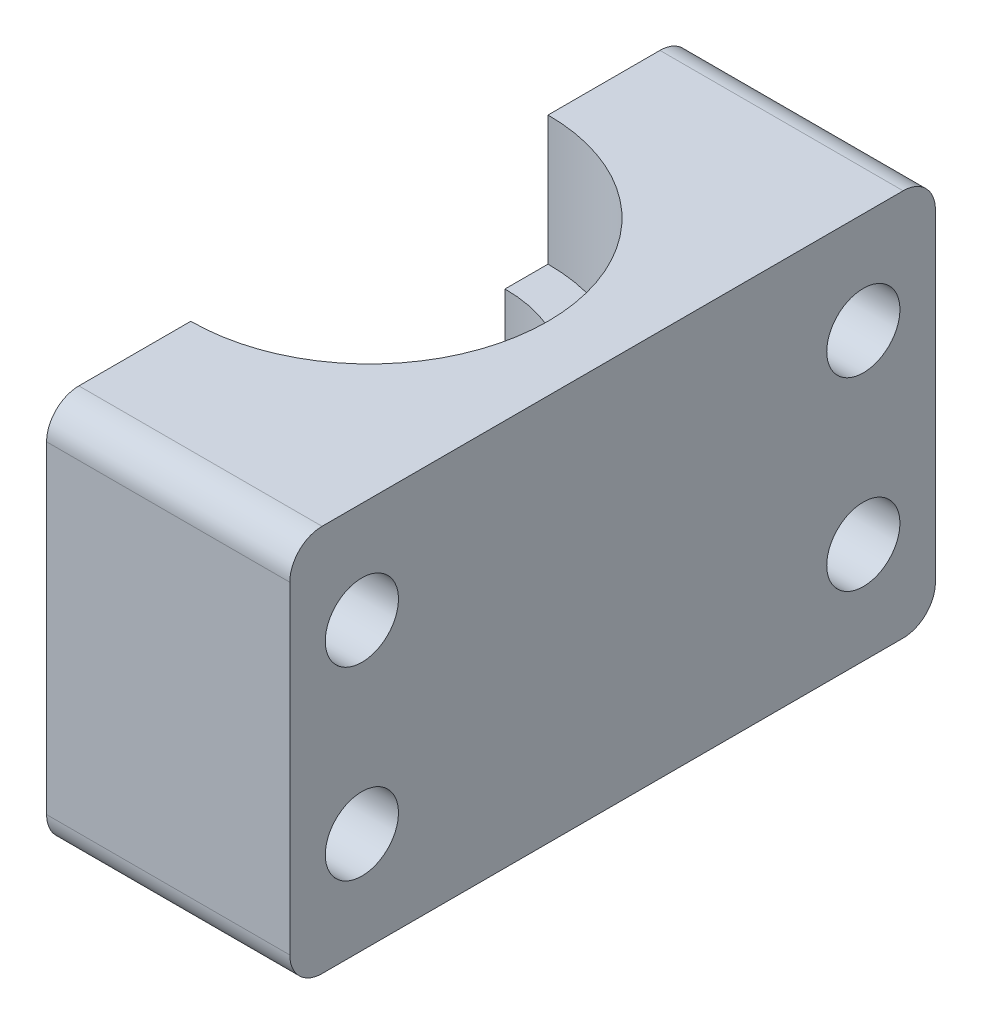
ISO-10303-21;
HEADER;
FILE_DESCRIPTION(('STEP AP214'),'2;1');
FILE_NAME('part.step','',(''),(''),'','','');
FILE_SCHEMA(('AUTOMOTIVE_DESIGN { 1 0 10303 214 1 1 1 1 }'));
ENDSEC;
DATA;
#1=APPLICATION_CONTEXT('core data for automotive mechanical design processes');
#2=APPLICATION_PROTOCOL_DEFINITION('international standard','automotive_design',2000,#1);
#3=PRODUCT_CONTEXT('',#1,'mechanical');
#4=PRODUCT('Part','Part','',(#3));
#5=PRODUCT_RELATED_PRODUCT_CATEGORY('part','',(#4));
#6=PRODUCT_DEFINITION_FORMATION('','',#4);
#7=PRODUCT_DEFINITION_CONTEXT('part definition',#1,'design');
#8=PRODUCT_DEFINITION('design','',#6,#7);
#9=PRODUCT_DEFINITION_SHAPE('','',#8);
#10=(LENGTH_UNIT() NAMED_UNIT(*) SI_UNIT(.MILLI.,.METRE.));
#11=(NAMED_UNIT(*) PLANE_ANGLE_UNIT() SI_UNIT($,.RADIAN.));
#12=(NAMED_UNIT(*) SI_UNIT($,.STERADIAN.) SOLID_ANGLE_UNIT());
#13=UNCERTAINTY_MEASURE_WITH_UNIT(LENGTH_MEASURE(1.E-05),#10,'distance_accuracy_value','');
#14=(GEOMETRIC_REPRESENTATION_CONTEXT(3) GLOBAL_UNCERTAINTY_ASSIGNED_CONTEXT((#13)) GLOBAL_UNIT_ASSIGNED_CONTEXT((#10,
#11,#12)) REPRESENTATION_CONTEXT('',''));
#15=CARTESIAN_POINT('',(0.,0.,0.));
#16=DIRECTION('',(0.,0.,1.));
#17=DIRECTION('',(1.,0.,0.));
#18=AXIS2_PLACEMENT_3D('',#15,#16,#17);
#19=CARTESIAN_POINT('',(100.,50.,-15.));
#20=DIRECTION('',(0.,0.,1.));
#21=DIRECTION('',(0.,-1.,0.));
#22=AXIS2_PLACEMENT_3D('',#19,#20,#21);
#23=PLANE('',#22);
#24=DIRECTION('',(0.,1.,0.));
#25=VECTOR('',#24,1.);
#26=CARTESIAN_POINT('',(0.,50.,-15.));
#27=LINE('',#26,#25);
#28=CARTESIAN_POINT('',(0.,-7.49999999999999,-15.));
#29=VERTEX_POINT('',#28);
#30=CARTESIAN_POINT('',(0.,7.49999999999999,-15.));
#31=VERTEX_POINT('',#30);
#32=EDGE_CURVE('E242',#29,#31,#27,.T.);
#33=ORIENTED_EDGE('',*,*,#32,.T.);
#34=DIRECTION('',(-1.,0.,0.));
#35=VECTOR('',#34,1.);
#36=CARTESIAN_POINT('',(11.3,7.49999999999999,-15.));
#37=LINE('',#36,#35);
#38=CARTESIAN_POINT('',(11.3,7.49999999999999,-15.));
#39=VERTEX_POINT('',#38);
#40=EDGE_CURVE('E186',#31,#39,#37,.F.);
#41=ORIENTED_EDGE('',*,*,#40,.T.);
#42=DIRECTION('',(0.,1.,0.));
#43=VECTOR('',#42,1.);
#44=CARTESIAN_POINT('',(11.3,-9.,-15.));
#45=LINE('',#44,#43);
#46=CARTESIAN_POINT('',(11.3,-7.49999999999999,-15.));
#47=VERTEX_POINT('',#46);
#48=EDGE_CURVE('E224',#47,#39,#45,.T.);
#49=ORIENTED_EDGE('',*,*,#48,.F.);
#50=DIRECTION('',(1.,0.,0.));
#51=VECTOR('',#50,1.);
#52=CARTESIAN_POINT('',(0.,-7.49999999999999,-15.));
#53=LINE('',#52,#51);
#54=EDGE_CURVE('E184',#47,#29,#53,.F.);
#55=ORIENTED_EDGE('',*,*,#54,.T.);
#56=EDGE_LOOP('',(#33,#41,#49,#55));
#57=FACE_BOUND('',#56,.T.);
#58=ADVANCED_FACE('F35',(#57),#23,.F.);
#59=CARTESIAN_POINT('',(100.,50.,15.));
#60=DIRECTION('',(0.,0.,-1.));
#61=DIRECTION('',(0.,1.,0.));
#62=AXIS2_PLACEMENT_3D('',#59,#60,#61);
#63=PLANE('',#62);
#64=DIRECTION('',(0.,-1.,0.));
#65=VECTOR('',#64,1.);
#66=CARTESIAN_POINT('',(0.,50.,15.));
#67=LINE('',#66,#65);
#68=CARTESIAN_POINT('',(0.,7.49999999999999,15.));
#69=VERTEX_POINT('',#68);
#70=CARTESIAN_POINT('',(0.,-7.49999999999999,15.));
#71=VERTEX_POINT('',#70);
#72=EDGE_CURVE('E206',#69,#71,#67,.T.);
#73=ORIENTED_EDGE('',*,*,#72,.T.);
#74=DIRECTION('',(-1.,0.,0.));
#75=VECTOR('',#74,1.);
#76=CARTESIAN_POINT('',(11.3,-7.49999999999999,15.));
#77=LINE('',#76,#75);
#78=CARTESIAN_POINT('',(11.3,-7.49999999999999,15.));
#79=VERTEX_POINT('',#78);
#80=EDGE_CURVE('E11',#71,#79,#77,.F.);
#81=ORIENTED_EDGE('',*,*,#80,.T.);
#82=DIRECTION('',(0.,1.,0.));
#83=VECTOR('',#82,1.);
#84=CARTESIAN_POINT('',(11.3,-9.,15.));
#85=LINE('',#84,#83);
#86=CARTESIAN_POINT('',(11.3,7.49999999999999,15.));
#87=VERTEX_POINT('',#86);
#88=EDGE_CURVE('E156',#79,#87,#85,.T.);
#89=ORIENTED_EDGE('',*,*,#88,.T.);
#90=DIRECTION('',(1.,0.,0.));
#91=VECTOR('',#90,1.);
#92=CARTESIAN_POINT('',(0.,7.49999999999999,15.));
#93=LINE('',#92,#91);
#94=EDGE_CURVE('E43',#87,#69,#93,.F.);
#95=ORIENTED_EDGE('',*,*,#94,.T.);
#96=EDGE_LOOP('',(#73,#81,#89,#95));
#97=FACE_BOUND('',#96,.T.);
#98=ADVANCED_FACE('F222',(#97),#63,.F.);
#99=CARTESIAN_POINT('',(0.,0.,0.));
#100=DIRECTION('',(1.,0.,0.));
#101=DIRECTION('',(0.,0.,-1.));
#102=AXIS2_PLACEMENT_3D('',#99,#100,#101);
#103=PLANE('',#102);
#104=CARTESIAN_POINT('',(0.,4.29999999999999,11.65));
#105=DIRECTION('',(-1.,0.,0.));
#106=DIRECTION('',(0.,0.,1.));
#107=AXIS2_PLACEMENT_3D('',#104,#105,#106);
#108=CIRCLE('',#107,1.7);
#109=CARTESIAN_POINT('',(0.,4.29999999999999,13.35));
#110=VERTEX_POINT('',#109);
#111=EDGE_CURVE('E306',#110,#110,#108,.T.);
#112=ORIENTED_EDGE('',*,*,#111,.F.);
#113=EDGE_LOOP('',(#112));
#114=FACE_BOUND('',#113,.T.);
#115=CARTESIAN_POINT('',(0.,-4.29999999999999,11.65));
#116=DIRECTION('',(-1.,0.,0.));
#117=DIRECTION('',(0.,0.,1.));
#118=AXIS2_PLACEMENT_3D('',#115,#116,#117);
#119=CIRCLE('',#118,1.7);
#120=CARTESIAN_POINT('',(0.,-4.29999999999999,13.35));
#121=VERTEX_POINT('',#120);
#122=EDGE_CURVE('E300',#121,#121,#119,.T.);
#123=ORIENTED_EDGE('',*,*,#122,.F.);
#124=EDGE_LOOP('',(#123));
#125=FACE_BOUND('',#124,.T.);
#126=DIRECTION('',(0.,0.,-1.));
#127=VECTOR('',#126,1.);
#128=CARTESIAN_POINT('',(0.,-8.99999999999999,0.));
#129=LINE('',#128,#127);
#130=CARTESIAN_POINT('',(0.,-8.99999999999999,13.5));
#131=VERTEX_POINT('',#130);
#132=CARTESIAN_POINT('',(0.,-9.,8.3));
#133=VERTEX_POINT('',#132);
#134=EDGE_CURVE('E134',#131,#133,#129,.T.);
#135=ORIENTED_EDGE('',*,*,#134,.F.);
#136=CARTESIAN_POINT('',(0.,-7.49999999999999,13.5));
#137=DIRECTION('',(1.,0.,0.));
#138=DIRECTION('',(0.,0.,-1.));
#139=AXIS2_PLACEMENT_3D('',#136,#137,#138);
#140=CIRCLE('',#139,1.5);
#141=EDGE_CURVE('E50',#131,#71,#140,.F.);
#142=ORIENTED_EDGE('',*,*,#141,.T.);
#143=ORIENTED_EDGE('',*,*,#72,.F.);
#144=CARTESIAN_POINT('',(0.,7.49999999999999,13.5));
#145=DIRECTION('',(1.,0.,0.));
#146=DIRECTION('',(0.,0.,-1.));
#147=AXIS2_PLACEMENT_3D('',#144,#145,#146);
#148=CIRCLE('',#147,1.5);
#149=CARTESIAN_POINT('',(0.,8.99999999999999,13.5));
#150=VERTEX_POINT('',#149);
#151=EDGE_CURVE('E200',#69,#150,#148,.F.);
#152=ORIENTED_EDGE('',*,*,#151,.T.);
#153=DIRECTION('',(0.,0.,1.));
#154=VECTOR('',#153,1.);
#155=CARTESIAN_POINT('',(0.,8.99999999999999,0.));
#156=LINE('',#155,#154);
#157=CARTESIAN_POINT('',(0.,9.,8.3));
#158=VERTEX_POINT('',#157);
#159=EDGE_CURVE('E173',#158,#150,#156,.T.);
#160=ORIENTED_EDGE('',*,*,#159,.F.);
#161=DIRECTION('',(0.,-1.,0.));
#162=VECTOR('',#161,1.);
#163=CARTESIAN_POINT('',(0.,-50.,8.3));
#164=LINE('',#163,#162);
#165=CARTESIAN_POINT('',(0.,3.,8.3));
#166=VERTEX_POINT('',#165);
#167=EDGE_CURVE('E171',#166,#158,#164,.F.);
#168=ORIENTED_EDGE('',*,*,#167,.F.);
#169=DIRECTION('',(0.,0.,1.));
#170=VECTOR('',#169,1.);
#171=CARTESIAN_POINT('',(0.,3.,0.));
#172=LINE('',#171,#170);
#173=CARTESIAN_POINT('',(0.,3.,6.3));
#174=VERTEX_POINT('',#173);
#175=EDGE_CURVE('E170',#174,#166,#172,.T.);
#176=ORIENTED_EDGE('',*,*,#175,.F.);
#177=DIRECTION('',(0.,-1.,0.));
#178=VECTOR('',#177,1.);
#179=CARTESIAN_POINT('',(0.,-50.,6.3));
#180=LINE('',#179,#178);
#181=CARTESIAN_POINT('',(0.,-3.,6.3));
#182=VERTEX_POINT('',#181);
#183=EDGE_CURVE('E163',#182,#174,#180,.F.);
#184=ORIENTED_EDGE('',*,*,#183,.F.);
#185=DIRECTION('',(0.,0.,-1.));
#186=VECTOR('',#185,1.);
#187=CARTESIAN_POINT('',(0.,-3.,0.));
#188=LINE('',#187,#186);
#189=CARTESIAN_POINT('',(0.,-3.,8.3));
#190=VERTEX_POINT('',#189);
#191=EDGE_CURVE('E161',#190,#182,#188,.T.);
#192=ORIENTED_EDGE('',*,*,#191,.F.);
#193=DIRECTION('',(0.,-1.,0.));
#194=VECTOR('',#193,1.);
#195=CARTESIAN_POINT('',(0.,-50.,8.3));
#196=LINE('',#195,#194);
#197=EDGE_CURVE('E144',#133,#190,#196,.F.);
#198=ORIENTED_EDGE('',*,*,#197,.F.);
#199=EDGE_LOOP('',(#135,#142,#143,#152,#160,#168,#176,#184,#192,#198));
#200=FACE_BOUND('',#199,.T.);
#201=ADVANCED_FACE('F159',(#114,#125,#200),#103,.F.);
#202=CARTESIAN_POINT('',(0.,-4.29999999999999,-11.65));
#203=DIRECTION('',(-1.,0.,0.));
#204=DIRECTION('',(0.,0.,1.));
#205=AXIS2_PLACEMENT_3D('',#202,#203,#204);
#206=CIRCLE('',#205,1.7);
#207=CARTESIAN_POINT('',(0.,-4.29999999999999,-9.95));
#208=VERTEX_POINT('',#207);
#209=EDGE_CURVE('E294',#208,#208,#206,.T.);
#210=ORIENTED_EDGE('',*,*,#209,.F.);
#211=EDGE_LOOP('',(#210));
#212=FACE_BOUND('',#211,.T.);
#213=CARTESIAN_POINT('',(0.,4.29999999999999,-11.65));
#214=DIRECTION('',(-1.,0.,0.));
#215=DIRECTION('',(0.,0.,1.));
#216=AXIS2_PLACEMENT_3D('',#213,#214,#215);
#217=CIRCLE('',#216,1.7);
#218=CARTESIAN_POINT('',(0.,4.29999999999999,-9.95));
#219=VERTEX_POINT('',#218);
#220=EDGE_CURVE('E286',#219,#219,#217,.T.);
#221=ORIENTED_EDGE('',*,*,#220,.F.);
#222=EDGE_LOOP('',(#221));
#223=FACE_BOUND('',#222,.T.);
#224=CARTESIAN_POINT('',(0.,8.99999999999999,-13.5));
#225=VERTEX_POINT('',#224);
#226=CARTESIAN_POINT('',(0.,9.,-8.3));
#227=VERTEX_POINT('',#226);
#228=EDGE_CURVE('E145',#225,#227,#156,.T.);
#229=ORIENTED_EDGE('',*,*,#228,.F.);
#230=CARTESIAN_POINT('',(0.,7.49999999999999,-13.5));
#231=DIRECTION('',(1.,0.,0.));
#232=DIRECTION('',(0.,0.,-1.));
#233=AXIS2_PLACEMENT_3D('',#230,#231,#232);
#234=CIRCLE('',#233,1.5);
#235=EDGE_CURVE('E182',#225,#31,#234,.F.);
#236=ORIENTED_EDGE('',*,*,#235,.T.);
#237=ORIENTED_EDGE('',*,*,#32,.F.);
#238=CARTESIAN_POINT('',(0.,-7.49999999999999,-13.5));
#239=DIRECTION('',(1.,0.,0.));
#240=DIRECTION('',(0.,0.,-1.));
#241=AXIS2_PLACEMENT_3D('',#238,#239,#240);
#242=CIRCLE('',#241,1.5);
#243=CARTESIAN_POINT('',(0.,-8.99999999999999,-13.5));
#244=VERTEX_POINT('',#243);
#245=EDGE_CURVE('E180',#29,#244,#242,.F.);
#246=ORIENTED_EDGE('',*,*,#245,.T.);
#247=CARTESIAN_POINT('',(0.,-9.,-8.3));
#248=VERTEX_POINT('',#247);
#249=EDGE_CURVE('E147',#248,#244,#129,.T.);
#250=ORIENTED_EDGE('',*,*,#249,.F.);
#251=DIRECTION('',(0.,-1.,0.));
#252=VECTOR('',#251,1.);
#253=CARTESIAN_POINT('',(0.,-50.,-8.3));
#254=LINE('',#253,#252);
#255=CARTESIAN_POINT('',(0.,-3.,-8.3));
#256=VERTEX_POINT('',#255);
#257=EDGE_CURVE('E153',#256,#248,#254,.T.);
#258=ORIENTED_EDGE('',*,*,#257,.F.);
#259=CARTESIAN_POINT('',(0.,-3.,-6.3));
#260=VERTEX_POINT('',#259);
#261=EDGE_CURVE('E165',#260,#256,#188,.T.);
#262=ORIENTED_EDGE('',*,*,#261,.F.);
#263=DIRECTION('',(0.,-1.,0.));
#264=VECTOR('',#263,1.);
#265=CARTESIAN_POINT('',(0.,-50.,-6.3));
#266=LINE('',#265,#264);
#267=CARTESIAN_POINT('',(0.,3.,-6.3));
#268=VERTEX_POINT('',#267);
#269=EDGE_CURVE('E247',#268,#260,#266,.T.);
#270=ORIENTED_EDGE('',*,*,#269,.F.);
#271=CARTESIAN_POINT('',(0.,3.,-8.3));
#272=VERTEX_POINT('',#271);
#273=EDGE_CURVE('E249',#272,#268,#172,.T.);
#274=ORIENTED_EDGE('',*,*,#273,.F.);
#275=DIRECTION('',(0.,-1.,0.));
#276=VECTOR('',#275,1.);
#277=CARTESIAN_POINT('',(0.,-50.,-8.3));
#278=LINE('',#277,#276);
#279=EDGE_CURVE('E250',#227,#272,#278,.T.);
#280=ORIENTED_EDGE('',*,*,#279,.F.);
#281=EDGE_LOOP('',(#229,#236,#237,#246,#250,#258,#262,#270,#274,#280));
#282=FACE_BOUND('',#281,.T.);
#283=ADVANCED_FACE('F259',(#212,#223,#282),#103,.F.);
#284=CARTESIAN_POINT('',(0.,8.99999999999999,8.3));
#285=DIRECTION('',(0.,1.,0.));
#286=DIRECTION('',(0.,0.,1.));
#287=AXIS2_PLACEMENT_3D('',#284,#285,#286);
#288=PLANE('',#287);
#289=DIRECTION('',(0.,0.,1.));
#290=VECTOR('',#289,1.);
#291=CARTESIAN_POINT('',(11.3,8.99999999999999,15.));
#292=LINE('',#291,#290);
#293=CARTESIAN_POINT('',(11.3,8.99999999999999,-13.5));
#294=VERTEX_POINT('',#293);
#295=CARTESIAN_POINT('',(11.3,8.99999999999999,13.5));
#296=VERTEX_POINT('',#295);
#297=EDGE_CURVE('E221',#294,#296,#292,.T.);
#298=ORIENTED_EDGE('',*,*,#297,.F.);
#299=DIRECTION('',(-1.,0.,0.));
#300=VECTOR('',#299,1.);
#301=CARTESIAN_POINT('',(0.,8.99999999999999,-13.5));
#302=LINE('',#301,#300);
#303=EDGE_CURVE('E177',#294,#225,#302,.T.);
#304=ORIENTED_EDGE('',*,*,#303,.T.);
#305=ORIENTED_EDGE('',*,*,#228,.T.);
#306=CARTESIAN_POINT('',(0.,9.,0.));
#307=DIRECTION('',(0.,-1.,0.));
#308=DIRECTION('',(0.,0.,-1.));
#309=AXIS2_PLACEMENT_3D('',#306,#307,#308);
#310=CIRCLE('',#309,8.3);
#311=EDGE_CURVE('E215',#227,#158,#310,.T.);
#312=ORIENTED_EDGE('',*,*,#311,.T.);
#313=ORIENTED_EDGE('',*,*,#159,.T.);
#314=DIRECTION('',(1.,0.,0.));
#315=VECTOR('',#314,1.);
#316=CARTESIAN_POINT('',(11.3,8.99999999999999,13.5));
#317=LINE('',#316,#315);
#318=EDGE_CURVE('E174',#150,#296,#317,.T.);
#319=ORIENTED_EDGE('',*,*,#318,.T.);
#320=EDGE_LOOP('',(#298,#304,#305,#312,#313,#319));
#321=FACE_BOUND('',#320,.T.);
#322=ADVANCED_FACE('F212',(#321),#288,.T.);
#323=CARTESIAN_POINT('',(0.,-50.,0.));
#324=DIRECTION('',(0.,-1.,0.));
#325=DIRECTION('',(0.,0.,-1.));
#326=AXIS2_PLACEMENT_3D('',#323,#324,#325);
#327=CYLINDRICAL_SURFACE('',#326,8.3);
#328=ORIENTED_EDGE('',*,*,#167,.T.);
#329=ORIENTED_EDGE('',*,*,#311,.F.);
#330=ORIENTED_EDGE('',*,*,#279,.T.);
#331=CARTESIAN_POINT('',(0.,3.,0.));
#332=DIRECTION('',(0.,-1.,0.));
#333=DIRECTION('',(0.,0.,-1.));
#334=AXIS2_PLACEMENT_3D('',#331,#332,#333);
#335=CIRCLE('',#334,8.3);
#336=EDGE_CURVE('E238',#272,#166,#335,.T.);
#337=ORIENTED_EDGE('',*,*,#336,.T.);
#338=EDGE_LOOP('',(#328,#329,#330,#337));
#339=FACE_BOUND('',#338,.T.);
#340=ADVANCED_FACE('F257',(#339),#327,.F.);
#341=CARTESIAN_POINT('',(0.,3.,8.3));
#342=DIRECTION('',(0.,1.,0.));
#343=DIRECTION('',(0.,0.,1.));
#344=AXIS2_PLACEMENT_3D('',#341,#342,#343);
#345=PLANE('',#344);
#346=ORIENTED_EDGE('',*,*,#273,.T.);
#347=CARTESIAN_POINT('',(0.,3.,0.));
#348=DIRECTION('',(0.,-1.,0.));
#349=DIRECTION('',(0.,0.,-1.));
#350=AXIS2_PLACEMENT_3D('',#347,#348,#349);
#351=CIRCLE('',#350,6.3);
#352=EDGE_CURVE('E235',#268,#174,#351,.T.);
#353=ORIENTED_EDGE('',*,*,#352,.T.);
#354=ORIENTED_EDGE('',*,*,#175,.T.);
#355=ORIENTED_EDGE('',*,*,#336,.F.);
#356=EDGE_LOOP('',(#346,#353,#354,#355));
#357=FACE_BOUND('',#356,.T.);
#358=ADVANCED_FACE('F264',(#357),#345,.T.);
#359=CARTESIAN_POINT('',(0.,-50.,0.));
#360=DIRECTION('',(0.,-1.,0.));
#361=DIRECTION('',(0.,0.,-1.));
#362=AXIS2_PLACEMENT_3D('',#359,#360,#361);
#363=CYLINDRICAL_SURFACE('',#362,6.3);
#364=ORIENTED_EDGE('',*,*,#183,.T.);
#365=ORIENTED_EDGE('',*,*,#352,.F.);
#366=ORIENTED_EDGE('',*,*,#269,.T.);
#367=CARTESIAN_POINT('',(0.,-3.,0.));
#368=DIRECTION('',(0.,-1.,0.));
#369=DIRECTION('',(0.,0.,-1.));
#370=AXIS2_PLACEMENT_3D('',#367,#368,#369);
#371=CIRCLE('',#370,6.3);
#372=EDGE_CURVE('E232',#260,#182,#371,.T.);
#373=ORIENTED_EDGE('',*,*,#372,.T.);
#374=EDGE_LOOP('',(#364,#365,#366,#373));
#375=FACE_BOUND('',#374,.T.);
#376=ADVANCED_FACE('F267',(#375),#363,.F.);
#377=CARTESIAN_POINT('',(0.,-3.,6.3));
#378=DIRECTION('',(0.,-1.,0.));
#379=DIRECTION('',(0.,0.,-1.));
#380=AXIS2_PLACEMENT_3D('',#377,#378,#379);
#381=PLANE('',#380);
#382=ORIENTED_EDGE('',*,*,#191,.T.);
#383=ORIENTED_EDGE('',*,*,#372,.F.);
#384=ORIENTED_EDGE('',*,*,#261,.T.);
#385=CARTESIAN_POINT('',(0.,-3.,0.));
#386=DIRECTION('',(0.,-1.,0.));
#387=DIRECTION('',(0.,0.,-1.));
#388=AXIS2_PLACEMENT_3D('',#385,#386,#387);
#389=CIRCLE('',#388,8.3);
#390=EDGE_CURVE('E155',#256,#190,#389,.T.);
#391=ORIENTED_EDGE('',*,*,#390,.T.);
#392=EDGE_LOOP('',(#382,#383,#384,#391));
#393=FACE_BOUND('',#392,.T.);
#394=ADVANCED_FACE('F270',(#393),#381,.T.);
#395=CARTESIAN_POINT('',(0.,-50.,0.));
#396=DIRECTION('',(0.,-1.,0.));
#397=DIRECTION('',(0.,0.,-1.));
#398=AXIS2_PLACEMENT_3D('',#395,#396,#397);
#399=CYLINDRICAL_SURFACE('',#398,8.3);
#400=ORIENTED_EDGE('',*,*,#197,.T.);
#401=ORIENTED_EDGE('',*,*,#390,.F.);
#402=ORIENTED_EDGE('',*,*,#257,.T.);
#403=CARTESIAN_POINT('',(0.,-9.,0.));
#404=DIRECTION('',(0.,-1.,0.));
#405=DIRECTION('',(0.,0.,-1.));
#406=AXIS2_PLACEMENT_3D('',#403,#404,#405);
#407=CIRCLE('',#406,8.3);
#408=EDGE_CURVE('E138',#248,#133,#407,.T.);
#409=ORIENTED_EDGE('',*,*,#408,.T.);
#410=EDGE_LOOP('',(#400,#401,#402,#409));
#411=FACE_BOUND('',#410,.T.);
#412=ADVANCED_FACE('F149',(#411),#399,.F.);
#413=CARTESIAN_POINT('',(0.,-8.99999999999999,8.3));
#414=DIRECTION('',(0.,-1.,0.));
#415=DIRECTION('',(0.,0.,-1.));
#416=AXIS2_PLACEMENT_3D('',#413,#414,#415);
#417=PLANE('',#416);
#418=ORIENTED_EDGE('',*,*,#249,.T.);
#419=DIRECTION('',(1.,0.,0.));
#420=VECTOR('',#419,1.);
#421=CARTESIAN_POINT('',(11.3,-8.99999999999999,-13.5));
#422=LINE('',#421,#420);
#423=CARTESIAN_POINT('',(11.3,-9.,-13.5));
#424=VERTEX_POINT('',#423);
#425=EDGE_CURVE('E197',#244,#424,#422,.T.);
#426=ORIENTED_EDGE('',*,*,#425,.T.);
#427=DIRECTION('',(0.,0.,1.));
#428=VECTOR('',#427,1.);
#429=CARTESIAN_POINT('',(11.3,-9.,15.));
#430=LINE('',#429,#428);
#431=CARTESIAN_POINT('',(11.3,-9.,13.5));
#432=VERTEX_POINT('',#431);
#433=EDGE_CURVE('E226',#424,#432,#430,.T.);
#434=ORIENTED_EDGE('',*,*,#433,.T.);
#435=DIRECTION('',(-1.,0.,0.));
#436=VECTOR('',#435,1.);
#437=CARTESIAN_POINT('',(0.,-8.99999999999999,13.5));
#438=LINE('',#437,#436);
#439=EDGE_CURVE('E142',#432,#131,#438,.T.);
#440=ORIENTED_EDGE('',*,*,#439,.T.);
#441=ORIENTED_EDGE('',*,*,#134,.T.);
#442=ORIENTED_EDGE('',*,*,#408,.F.);
#443=EDGE_LOOP('',(#418,#426,#434,#440,#441,#442));
#444=FACE_BOUND('',#443,.T.);
#445=ADVANCED_FACE('F137',(#444),#417,.T.);
#446=CARTESIAN_POINT('',(11.3,-9.,15.));
#447=DIRECTION('',(-1.,0.,0.));
#448=DIRECTION('',(0.,0.,1.));
#449=AXIS2_PLACEMENT_3D('',#446,#447,#448);
#450=PLANE('',#449);
#451=CARTESIAN_POINT('',(11.3,4.29999999999999,11.65));
#452=DIRECTION('',(-1.,0.,0.));
#453=DIRECTION('',(0.,0.,1.));
#454=AXIS2_PLACEMENT_3D('',#451,#452,#453);
#455=CIRCLE('',#454,1.7);
#456=CARTESIAN_POINT('',(11.3,4.29999999999999,13.35));
#457=VERTEX_POINT('',#456);
#458=EDGE_CURVE('E303',#457,#457,#455,.T.);
#459=ORIENTED_EDGE('',*,*,#458,.T.);
#460=EDGE_LOOP('',(#459));
#461=FACE_BOUND('',#460,.T.);
#462=CARTESIAN_POINT('',(11.3,-4.29999999999999,11.65));
#463=DIRECTION('',(-1.,0.,0.));
#464=DIRECTION('',(0.,0.,1.));
#465=AXIS2_PLACEMENT_3D('',#462,#463,#464);
#466=CIRCLE('',#465,1.7);
#467=CARTESIAN_POINT('',(11.3,-4.29999999999999,13.35));
#468=VERTEX_POINT('',#467);
#469=EDGE_CURVE('E297',#468,#468,#466,.T.);
#470=ORIENTED_EDGE('',*,*,#469,.T.);
#471=EDGE_LOOP('',(#470));
#472=FACE_BOUND('',#471,.T.);
#473=CARTESIAN_POINT('',(11.3,-4.29999999999999,-11.65));
#474=DIRECTION('',(-1.,0.,0.));
#475=DIRECTION('',(0.,0.,1.));
#476=AXIS2_PLACEMENT_3D('',#473,#474,#475);
#477=CIRCLE('',#476,1.7);
#478=CARTESIAN_POINT('',(11.3,-4.29999999999999,-9.95));
#479=VERTEX_POINT('',#478);
#480=EDGE_CURVE('E291',#479,#479,#477,.T.);
#481=ORIENTED_EDGE('',*,*,#480,.T.);
#482=EDGE_LOOP('',(#481));
#483=FACE_BOUND('',#482,.T.);
#484=CARTESIAN_POINT('',(11.3,4.29999999999999,-11.65));
#485=DIRECTION('',(-1.,0.,0.));
#486=DIRECTION('',(0.,0.,1.));
#487=AXIS2_PLACEMENT_3D('',#484,#485,#486);
#488=CIRCLE('',#487,1.7);
#489=CARTESIAN_POINT('',(11.3,4.29999999999999,-9.95));
#490=VERTEX_POINT('',#489);
#491=EDGE_CURVE('E284',#490,#490,#488,.T.);
#492=ORIENTED_EDGE('',*,*,#491,.T.);
#493=EDGE_LOOP('',(#492));
#494=FACE_BOUND('',#493,.T.);
#495=ORIENTED_EDGE('',*,*,#48,.T.);
#496=CARTESIAN_POINT('',(11.3,7.49999999999999,-13.5));
#497=DIRECTION('',(-1.,0.,0.));
#498=DIRECTION('',(0.,0.,1.));
#499=AXIS2_PLACEMENT_3D('',#496,#497,#498);
#500=CIRCLE('',#499,1.5);
#501=EDGE_CURVE('E194',#39,#294,#500,.F.);
#502=ORIENTED_EDGE('',*,*,#501,.T.);
#503=ORIENTED_EDGE('',*,*,#297,.T.);
#504=CARTESIAN_POINT('',(11.3,7.49999999999999,13.5));
#505=DIRECTION('',(-1.,0.,0.));
#506=DIRECTION('',(0.,0.,1.));
#507=AXIS2_PLACEMENT_3D('',#504,#505,#506);
#508=CIRCLE('',#507,1.5);
#509=EDGE_CURVE('E188',#296,#87,#508,.F.);
#510=ORIENTED_EDGE('',*,*,#509,.T.);
#511=ORIENTED_EDGE('',*,*,#88,.F.);
#512=CARTESIAN_POINT('',(11.3,-7.49999999999999,13.5));
#513=DIRECTION('',(-1.,0.,0.));
#514=DIRECTION('',(0.,0.,1.));
#515=AXIS2_PLACEMENT_3D('',#512,#513,#514);
#516=CIRCLE('',#515,1.5);
#517=EDGE_CURVE('E190',#79,#432,#516,.F.);
#518=ORIENTED_EDGE('',*,*,#517,.T.);
#519=ORIENTED_EDGE('',*,*,#433,.F.);
#520=CARTESIAN_POINT('',(11.3,-7.49999999999999,-13.5));
#521=DIRECTION('',(-1.,0.,0.));
#522=DIRECTION('',(0.,0.,1.));
#523=AXIS2_PLACEMENT_3D('',#520,#521,#522);
#524=CIRCLE('',#523,1.5);
#525=EDGE_CURVE('E192',#424,#47,#524,.F.);
#526=ORIENTED_EDGE('',*,*,#525,.T.);
#527=EDGE_LOOP('',(#495,#502,#503,#510,#511,#518,#519,#526));
#528=FACE_BOUND('',#527,.T.);
#529=ADVANCED_FACE('F219',(#461,#472,#483,#494,#528),#450,.F.);
#530=CARTESIAN_POINT('',(11.3,4.29999999999999,-11.65));
#531=DIRECTION('',(-1.,0.,0.));
#532=DIRECTION('',(0.,0.,1.));
#533=AXIS2_PLACEMENT_3D('',#530,#531,#532);
#534=CYLINDRICAL_SURFACE('',#533,1.7);
#535=ORIENTED_EDGE('',*,*,#491,.F.);
#536=EDGE_LOOP('',(#535));
#537=FACE_BOUND('',#536,.T.);
#538=ORIENTED_EDGE('',*,*,#220,.T.);
#539=EDGE_LOOP('',(#538));
#540=FACE_BOUND('',#539,.T.);
#541=ADVANCED_FACE('F333',(#537,#540),#534,.F.);
#542=CARTESIAN_POINT('',(11.3,-4.29999999999999,-11.65));
#543=DIRECTION('',(-1.,0.,0.));
#544=DIRECTION('',(0.,0.,1.));
#545=AXIS2_PLACEMENT_3D('',#542,#543,#544);
#546=CYLINDRICAL_SURFACE('',#545,1.7);
#547=ORIENTED_EDGE('',*,*,#480,.F.);
#548=EDGE_LOOP('',(#547));
#549=FACE_BOUND('',#548,.T.);
#550=ORIENTED_EDGE('',*,*,#209,.T.);
#551=EDGE_LOOP('',(#550));
#552=FACE_BOUND('',#551,.T.);
#553=ADVANCED_FACE('F327',(#549,#552),#546,.F.);
#554=CARTESIAN_POINT('',(11.3,-4.29999999999999,11.65));
#555=DIRECTION('',(-1.,0.,0.));
#556=DIRECTION('',(0.,0.,1.));
#557=AXIS2_PLACEMENT_3D('',#554,#555,#556);
#558=CYLINDRICAL_SURFACE('',#557,1.7);
#559=ORIENTED_EDGE('',*,*,#469,.F.);
#560=EDGE_LOOP('',(#559));
#561=FACE_BOUND('',#560,.T.);
#562=ORIENTED_EDGE('',*,*,#122,.T.);
#563=EDGE_LOOP('',(#562));
#564=FACE_BOUND('',#563,.T.);
#565=ADVANCED_FACE('F317',(#561,#564),#558,.F.);
#566=CARTESIAN_POINT('',(11.3,4.29999999999999,11.65));
#567=DIRECTION('',(-1.,0.,0.));
#568=DIRECTION('',(0.,0.,1.));
#569=AXIS2_PLACEMENT_3D('',#566,#567,#568);
#570=CYLINDRICAL_SURFACE('',#569,1.7);
#571=ORIENTED_EDGE('',*,*,#458,.F.);
#572=EDGE_LOOP('',(#571));
#573=FACE_BOUND('',#572,.T.);
#574=ORIENTED_EDGE('',*,*,#111,.T.);
#575=EDGE_LOOP('',(#574));
#576=FACE_BOUND('',#575,.T.);
#577=ADVANCED_FACE('F314',(#573,#576),#570,.F.);
#578=CARTESIAN_POINT('',(0.,7.49999999999999,-13.5));
#579=DIRECTION('',(1.,0.,0.));
#580=DIRECTION('',(0.,0.,-1.));
#581=AXIS2_PLACEMENT_3D('',#578,#579,#580);
#582=CYLINDRICAL_SURFACE('',#581,1.5);
#583=ORIENTED_EDGE('',*,*,#501,.F.);
#584=ORIENTED_EDGE('',*,*,#40,.F.);
#585=ORIENTED_EDGE('',*,*,#235,.F.);
#586=ORIENTED_EDGE('',*,*,#303,.F.);
#587=EDGE_LOOP('',(#583,#584,#585,#586));
#588=FACE_BOUND('',#587,.T.);
#589=ADVANCED_FACE('F283',(#588),#582,.T.);
#590=CARTESIAN_POINT('',(0.,-7.49999999999999,-13.5));
#591=DIRECTION('',(-1.,0.,0.));
#592=DIRECTION('',(0.,0.,1.));
#593=AXIS2_PLACEMENT_3D('',#590,#591,#592);
#594=CYLINDRICAL_SURFACE('',#593,1.5);
#595=ORIENTED_EDGE('',*,*,#245,.F.);
#596=ORIENTED_EDGE('',*,*,#54,.F.);
#597=ORIENTED_EDGE('',*,*,#525,.F.);
#598=ORIENTED_EDGE('',*,*,#425,.F.);
#599=EDGE_LOOP('',(#595,#596,#597,#598));
#600=FACE_BOUND('',#599,.T.);
#601=ADVANCED_FACE('F276',(#600),#594,.T.);
#602=CARTESIAN_POINT('',(0.,-7.49999999999999,13.5));
#603=DIRECTION('',(1.,0.,0.));
#604=DIRECTION('',(0.,0.,-1.));
#605=AXIS2_PLACEMENT_3D('',#602,#603,#604);
#606=CYLINDRICAL_SURFACE('',#605,1.5);
#607=ORIENTED_EDGE('',*,*,#517,.F.);
#608=ORIENTED_EDGE('',*,*,#80,.F.);
#609=ORIENTED_EDGE('',*,*,#141,.F.);
#610=ORIENTED_EDGE('',*,*,#439,.F.);
#611=EDGE_LOOP('',(#607,#608,#609,#610));
#612=FACE_BOUND('',#611,.T.);
#613=ADVANCED_FACE('F347',(#612),#606,.T.);
#614=CARTESIAN_POINT('',(0.,7.49999999999999,13.5));
#615=DIRECTION('',(-1.,0.,0.));
#616=DIRECTION('',(0.,0.,1.));
#617=AXIS2_PLACEMENT_3D('',#614,#615,#616);
#618=CYLINDRICAL_SURFACE('',#617,1.5);
#619=ORIENTED_EDGE('',*,*,#151,.F.);
#620=ORIENTED_EDGE('',*,*,#94,.F.);
#621=ORIENTED_EDGE('',*,*,#509,.F.);
#622=ORIENTED_EDGE('',*,*,#318,.F.);
#623=EDGE_LOOP('',(#619,#620,#621,#622));
#624=FACE_BOUND('',#623,.T.);
#625=ADVANCED_FACE('F37',(#624),#618,.T.);
#626=CLOSED_SHELL('',(#58,#98,#201,#283,#322,#340,#358,#376,#394,#412,#445,#529,#541,#553,#565,
#577,#589,#601,#613,#625));
#627=MANIFOLD_SOLID_BREP('B2',#626);
#628=ADVANCED_BREP_SHAPE_REPRESENTATION('',(#18,#627),#14);
#629=SHAPE_DEFINITION_REPRESENTATION(#9,#628);
ENDSEC;
END-ISO-10303-21;
